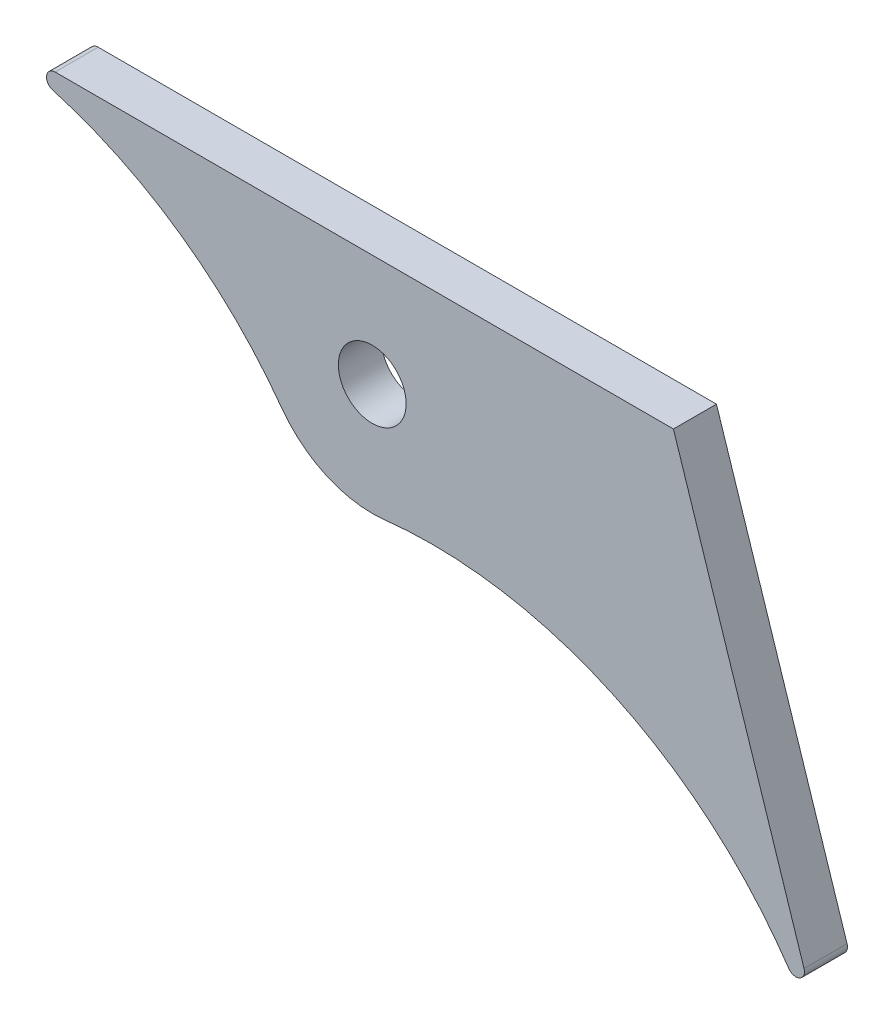
ISO-10303-21;
HEADER;
FILE_DESCRIPTION(('STEP AP214'),'2;1');
FILE_NAME('part.step','',(''),(''),'','','');
FILE_SCHEMA(('AUTOMOTIVE_DESIGN { 1 0 10303 214 1 1 1 1 }'));
ENDSEC;
DATA;
#1=APPLICATION_CONTEXT('core data for automotive mechanical design processes');
#2=APPLICATION_PROTOCOL_DEFINITION('international standard','automotive_design',2000,#1);
#3=PRODUCT_CONTEXT('',#1,'mechanical');
#4=PRODUCT('Part','Part','',(#3));
#5=PRODUCT_RELATED_PRODUCT_CATEGORY('part','',(#4));
#6=PRODUCT_DEFINITION_FORMATION('','',#4);
#7=PRODUCT_DEFINITION_CONTEXT('part definition',#1,'design');
#8=PRODUCT_DEFINITION('design','',#6,#7);
#9=PRODUCT_DEFINITION_SHAPE('','',#8);
#10=(LENGTH_UNIT() NAMED_UNIT(*) SI_UNIT(.MILLI.,.METRE.));
#11=(NAMED_UNIT(*) PLANE_ANGLE_UNIT() SI_UNIT($,.RADIAN.));
#12=(NAMED_UNIT(*) SI_UNIT($,.STERADIAN.) SOLID_ANGLE_UNIT());
#13=UNCERTAINTY_MEASURE_WITH_UNIT(LENGTH_MEASURE(1.E-05),#10,'distance_accuracy_value','');
#14=(GEOMETRIC_REPRESENTATION_CONTEXT(3) GLOBAL_UNCERTAINTY_ASSIGNED_CONTEXT((#13)) GLOBAL_UNIT_ASSIGNED_CONTEXT((#10,
#11,#12)) REPRESENTATION_CONTEXT('',''));
#15=CARTESIAN_POINT('',(0.,0.,0.));
#16=DIRECTION('',(0.,0.,1.));
#17=DIRECTION('',(1.,0.,0.));
#18=AXIS2_PLACEMENT_3D('',#15,#16,#17);
#19=CARTESIAN_POINT('',(-35.5673093415989,-96.0253941489769,6.35));
#20=DIRECTION('',(0.,0.,1.));
#21=DIRECTION('',(1.,0.,0.));
#22=AXIS2_PLACEMENT_3D('',#19,#20,#21);
#23=PLANE('',#22);
#24=DIRECTION('',(-1.,0.,0.));
#25=VECTOR('',#24,1.);
#26=CARTESIAN_POINT('',(0.,0.,6.35));
#27=LINE('',#26,#25);
#28=CARTESIAN_POINT('',(0.,0.,6.35));
#29=VERTEX_POINT('',#28);
#30=CARTESIAN_POINT('',(-91.24703558049,0.,6.35));
#31=VERTEX_POINT('',#30);
#32=EDGE_CURVE('E100',#29,#31,#27,.T.);
#33=ORIENTED_EDGE('',*,*,#32,.T.);
#34=CARTESIAN_POINT('',(-91.24703558049,-1.27000000000001,6.35));
#35=DIRECTION('',(0.,0.,1.));
#36=DIRECTION('',(1.,0.,0.));
#37=AXIS2_PLACEMENT_3D('',#34,#35,#36);
#38=CIRCLE('',#37,1.27);
#39=CARTESIAN_POINT('',(-91.5992024871987,-2.49019607843137,6.35));
#40=VERTEX_POINT('',#39);
#41=EDGE_CURVE('E146',#31,#40,#38,.T.);
#42=ORIENTED_EDGE('',*,*,#41,.T.);
#43=CARTESIAN_POINT('',(-109.207547822628,-63.5,6.35));
#44=DIRECTION('',(0.,0.,-1.));
#45=DIRECTION('',(1.,0.,0.));
#46=AXIS2_PLACEMENT_3D('',#43,#44,#45);
#47=CIRCLE('',#46,63.5);
#48=CARTESIAN_POINT('',(-57.8126685983201,-26.2063492063492,6.35));
#49=VERTEX_POINT('',#48);
#50=EDGE_CURVE('E117',#40,#49,#47,.T.);
#51=ORIENTED_EDGE('',*,*,#50,.T.);
#52=CARTESIAN_POINT('',(-44.45,-16.51,6.35));
#53=DIRECTION('',(0.,0.,1.));
#54=DIRECTION('',(1.,0.,0.));
#55=AXIS2_PLACEMENT_3D('',#52,#53,#54);
#56=CIRCLE('',#55,16.51);
#57=CARTESIAN_POINT('',(-42.6170638323934,-32.9179384751857,6.35));
#58=VERTEX_POINT('',#57);
#59=EDGE_CURVE('E180',#49,#58,#56,.T.);
#60=ORIENTED_EDGE('',*,*,#59,.T.);
#61=CARTESIAN_POINT('',(-35.5673093415989,-96.0253941489769,6.35));
#62=DIRECTION('',(0.,0.,-1.));
#63=DIRECTION('',(1.,0.,0.));
#64=AXIS2_PLACEMENT_3D('',#61,#62,#63);
#65=CIRCLE('',#64,63.5);
#66=CARTESIAN_POINT('',(17.0151842844278,-60.4257963412929,6.35));
#67=VERTEX_POINT('',#66);
#68=EDGE_CURVE('E167',#58,#67,#65,.T.);
#69=ORIENTED_EDGE('',*,*,#68,.T.);
#70=CARTESIAN_POINT('',(18.0668341569483,-59.7138043851392,6.35));
#71=DIRECTION('',(0.,0.,1.));
#72=DIRECTION('',(1.,0.,0.));
#73=AXIS2_PLACEMENT_3D('',#70,#71,#72);
#74=CIRCLE('',#73,1.27);
#75=CARTESIAN_POINT('',(19.2746759326432,-59.321352802283,6.35));
#76=VERTEX_POINT('',#75);
#77=EDGE_CURVE('E60',#67,#76,#74,.T.);
#78=ORIENTED_EDGE('',*,*,#77,.T.);
#79=DIRECTION('',(-0.309016994374952,0.951056516295152,0.));
#80=VECTOR('',#79,1.);
#81=CARTESIAN_POINT('',(0.,0.,6.35));
#82=LINE('',#81,#80);
#83=EDGE_CURVE('E97',#76,#29,#82,.T.);
#84=ORIENTED_EDGE('',*,*,#83,.T.);
#85=EDGE_LOOP('',(#33,#42,#51,#60,#69,#78,#84));
#86=FACE_BOUND('',#85,.T.);
#87=CARTESIAN_POINT('',(-44.45,-16.51,6.35));
#88=DIRECTION('',(0.,0.,1.));
#89=DIRECTION('',(1.,0.,0.));
#90=AXIS2_PLACEMENT_3D('',#87,#88,#89);
#91=CIRCLE('',#90,5.);
#92=CARTESIAN_POINT('',(-39.45,-16.51,6.35));
#93=VERTEX_POINT('',#92);
#94=EDGE_CURVE('E157',#93,#93,#91,.T.);
#95=ORIENTED_EDGE('',*,*,#94,.F.);
#96=EDGE_LOOP('',(#95));
#97=FACE_BOUND('',#96,.T.);
#98=ADVANCED_FACE('F39',(#86,#97),#23,.T.);
#99=CARTESIAN_POINT('',(-35.5673093415989,-96.0253941489769,0.));
#100=DIRECTION('',(0.,0.,1.));
#101=DIRECTION('',(1.,0.,0.));
#102=AXIS2_PLACEMENT_3D('',#99,#100,#101);
#103=PLANE('',#102);
#104=CARTESIAN_POINT('',(-109.207547822628,-63.5,0.));
#105=DIRECTION('',(0.,0.,-1.));
#106=DIRECTION('',(1.,0.,0.));
#107=AXIS2_PLACEMENT_3D('',#104,#105,#106);
#108=CIRCLE('',#107,63.5);
#109=CARTESIAN_POINT('',(-91.5992024871987,-2.49019607843137,0.));
#110=VERTEX_POINT('',#109);
#111=CARTESIAN_POINT('',(-57.8126685983201,-26.2063492063492,0.));
#112=VERTEX_POINT('',#111);
#113=EDGE_CURVE('E161',#110,#112,#108,.T.);
#114=ORIENTED_EDGE('',*,*,#113,.F.);
#115=CARTESIAN_POINT('',(-91.24703558049,-1.27000000000001,0.));
#116=DIRECTION('',(0.,0.,1.));
#117=DIRECTION('',(1.,0.,0.));
#118=AXIS2_PLACEMENT_3D('',#115,#116,#117);
#119=CIRCLE('',#118,1.27);
#120=CARTESIAN_POINT('',(-91.24703558049,0.,0.));
#121=VERTEX_POINT('',#120);
#122=EDGE_CURVE('E139',#110,#121,#119,.F.);
#123=ORIENTED_EDGE('',*,*,#122,.T.);
#124=DIRECTION('',(-1.,0.,0.));
#125=VECTOR('',#124,1.);
#126=CARTESIAN_POINT('',(-44.45,0.,0.));
#127=LINE('',#126,#125);
#128=CARTESIAN_POINT('',(0.,0.,0.));
#129=VERTEX_POINT('',#128);
#130=EDGE_CURVE('E155',#129,#121,#127,.T.);
#131=ORIENTED_EDGE('',*,*,#130,.F.);
#132=DIRECTION('',(-0.309016994374952,0.951056516295152,0.));
#133=VECTOR('',#132,1.);
#134=CARTESIAN_POINT('',(0.,0.,0.));
#135=LINE('',#134,#133);
#136=CARTESIAN_POINT('',(19.2746759326432,-59.321352802283,0.));
#137=VERTEX_POINT('',#136);
#138=EDGE_CURVE('E121',#137,#129,#135,.T.);
#139=ORIENTED_EDGE('',*,*,#138,.F.);
#140=CARTESIAN_POINT('',(18.0668341569483,-59.7138043851392,0.));
#141=DIRECTION('',(0.,0.,1.));
#142=DIRECTION('',(1.,0.,0.));
#143=AXIS2_PLACEMENT_3D('',#140,#141,#142);
#144=CIRCLE('',#143,1.27);
#145=CARTESIAN_POINT('',(17.0151842844278,-60.4257963412929,0.));
#146=VERTEX_POINT('',#145);
#147=EDGE_CURVE('E130',#137,#146,#144,.F.);
#148=ORIENTED_EDGE('',*,*,#147,.T.);
#149=CARTESIAN_POINT('',(-35.5673093415989,-96.0253941489769,0.));
#150=DIRECTION('',(0.,0.,-1.));
#151=DIRECTION('',(1.,0.,0.));
#152=AXIS2_PLACEMENT_3D('',#149,#150,#151);
#153=CIRCLE('',#152,63.5);
#154=CARTESIAN_POINT('',(-42.6170638323934,-32.9179384751857,0.));
#155=VERTEX_POINT('',#154);
#156=EDGE_CURVE('E107',#155,#146,#153,.T.);
#157=ORIENTED_EDGE('',*,*,#156,.F.);
#158=CARTESIAN_POINT('',(-44.45,-16.51,0.));
#159=DIRECTION('',(0.,0.,1.));
#160=DIRECTION('',(1.,0.,0.));
#161=AXIS2_PLACEMENT_3D('',#158,#159,#160);
#162=CIRCLE('',#161,16.51);
#163=EDGE_CURVE('E172',#112,#155,#162,.T.);
#164=ORIENTED_EDGE('',*,*,#163,.F.);
#165=EDGE_LOOP('',(#114,#123,#131,#139,#148,#157,#164));
#166=FACE_BOUND('',#165,.T.);
#167=CARTESIAN_POINT('',(-44.45,-16.51,0.));
#168=DIRECTION('',(0.,0.,1.));
#169=DIRECTION('',(1.,0.,0.));
#170=AXIS2_PLACEMENT_3D('',#167,#168,#169);
#171=CIRCLE('',#170,5.);
#172=CARTESIAN_POINT('',(-39.45,-16.51,0.));
#173=VERTEX_POINT('',#172);
#174=EDGE_CURVE('E164',#173,#173,#171,.T.);
#175=ORIENTED_EDGE('',*,*,#174,.T.);
#176=EDGE_LOOP('',(#175));
#177=FACE_BOUND('',#176,.T.);
#178=ADVANCED_FACE('F152',(#166,#177),#103,.F.);
#179=CARTESIAN_POINT('',(0.,0.,6.35));
#180=DIRECTION('',(-0.951056516295152,-0.309016994374952,0.));
#181=DIRECTION('',(0.309016994374952,-0.951056516295152,0.));
#182=AXIS2_PLACEMENT_3D('',#179,#180,#181);
#183=PLANE('',#182);
#184=ORIENTED_EDGE('',*,*,#83,.F.);
#185=DIRECTION('',(0.,0.,-1.));
#186=VECTOR('',#185,1.);
#187=CARTESIAN_POINT('',(19.2746759326432,-59.321352802283,6.35));
#188=LINE('',#187,#186);
#189=EDGE_CURVE('E48',#76,#137,#188,.T.);
#190=ORIENTED_EDGE('',*,*,#189,.T.);
#191=ORIENTED_EDGE('',*,*,#138,.T.);
#192=DIRECTION('',(0.,0.,-1.));
#193=VECTOR('',#192,1.);
#194=CARTESIAN_POINT('',(0.,0.,6.35));
#195=LINE('',#194,#193);
#196=EDGE_CURVE('E113',#29,#129,#195,.T.);
#197=ORIENTED_EDGE('',*,*,#196,.F.);
#198=EDGE_LOOP('',(#184,#190,#191,#197));
#199=FACE_BOUND('',#198,.T.);
#200=ADVANCED_FACE('F119',(#199),#183,.F.);
#201=CARTESIAN_POINT('',(-44.45,0.,6.35));
#202=DIRECTION('',(0.,-1.,0.));
#203=DIRECTION('',(1.,0.,0.));
#204=AXIS2_PLACEMENT_3D('',#201,#202,#203);
#205=PLANE('',#204);
#206=ORIENTED_EDGE('',*,*,#130,.T.);
#207=DIRECTION('',(0.,0.,-1.));
#208=VECTOR('',#207,1.);
#209=CARTESIAN_POINT('',(-91.24703558049,0.,6.35));
#210=LINE('',#209,#208);
#211=EDGE_CURVE('E115',#121,#31,#210,.F.);
#212=ORIENTED_EDGE('',*,*,#211,.T.);
#213=ORIENTED_EDGE('',*,*,#32,.F.);
#214=ORIENTED_EDGE('',*,*,#196,.T.);
#215=EDGE_LOOP('',(#206,#212,#213,#214));
#216=FACE_BOUND('',#215,.T.);
#217=ADVANCED_FACE('F112',(#216),#205,.F.);
#218=CARTESIAN_POINT('',(-109.207547822628,-63.5,6.35));
#219=DIRECTION('',(0.,0.,-1.));
#220=DIRECTION('',(-1.,0.,0.));
#221=AXIS2_PLACEMENT_3D('',#218,#219,#220);
#222=CYLINDRICAL_SURFACE('',#221,63.5);
#223=ORIENTED_EDGE('',*,*,#50,.F.);
#224=DIRECTION('',(0.,0.,-1.));
#225=VECTOR('',#224,1.);
#226=CARTESIAN_POINT('',(-91.5992024871987,-2.49019607843137,6.35));
#227=LINE('',#226,#225);
#228=EDGE_CURVE('E124',#40,#110,#227,.T.);
#229=ORIENTED_EDGE('',*,*,#228,.T.);
#230=ORIENTED_EDGE('',*,*,#113,.T.);
#231=DIRECTION('',(0.,0.,-1.));
#232=VECTOR('',#231,1.);
#233=CARTESIAN_POINT('',(-57.8126685983201,-26.2063492063492,6.35));
#234=LINE('',#233,#232);
#235=EDGE_CURVE('E125',#49,#112,#234,.T.);
#236=ORIENTED_EDGE('',*,*,#235,.F.);
#237=EDGE_LOOP('',(#223,#229,#230,#236));
#238=FACE_BOUND('',#237,.T.);
#239=ADVANCED_FACE('F212',(#238),#222,.F.);
#240=CARTESIAN_POINT('',(-44.45,-16.51,6.35));
#241=DIRECTION('',(0.,0.,-1.));
#242=DIRECTION('',(-1.,0.,0.));
#243=AXIS2_PLACEMENT_3D('',#240,#241,#242);
#244=CYLINDRICAL_SURFACE('',#243,16.51);
#245=ORIENTED_EDGE('',*,*,#163,.T.);
#246=DIRECTION('',(0.,0.,-1.));
#247=VECTOR('',#246,1.);
#248=CARTESIAN_POINT('',(-42.6170638323934,-32.9179384751857,6.35));
#249=LINE('',#248,#247);
#250=EDGE_CURVE('E133',#58,#155,#249,.T.);
#251=ORIENTED_EDGE('',*,*,#250,.F.);
#252=ORIENTED_EDGE('',*,*,#59,.F.);
#253=ORIENTED_EDGE('',*,*,#235,.T.);
#254=EDGE_LOOP('',(#245,#251,#252,#253));
#255=FACE_BOUND('',#254,.T.);
#256=ADVANCED_FACE('F201',(#255),#244,.T.);
#257=CARTESIAN_POINT('',(-35.5673093415989,-96.0253941489769,6.35));
#258=DIRECTION('',(0.,0.,-1.));
#259=DIRECTION('',(-1.,0.,0.));
#260=AXIS2_PLACEMENT_3D('',#257,#258,#259);
#261=CYLINDRICAL_SURFACE('',#260,63.5);
#262=ORIENTED_EDGE('',*,*,#156,.T.);
#263=DIRECTION('',(0.,0.,-1.));
#264=VECTOR('',#263,1.);
#265=CARTESIAN_POINT('',(17.0151842844278,-60.4257963412929,6.35));
#266=LINE('',#265,#264);
#267=EDGE_CURVE('E11',#146,#67,#266,.F.);
#268=ORIENTED_EDGE('',*,*,#267,.T.);
#269=ORIENTED_EDGE('',*,*,#68,.F.);
#270=ORIENTED_EDGE('',*,*,#250,.T.);
#271=EDGE_LOOP('',(#262,#268,#269,#270));
#272=FACE_BOUND('',#271,.T.);
#273=ADVANCED_FACE('F193',(#272),#261,.F.);
#274=CARTESIAN_POINT('',(-44.45,-16.51,6.35));
#275=DIRECTION('',(0.,0.,-1.));
#276=DIRECTION('',(-1.,0.,0.));
#277=AXIS2_PLACEMENT_3D('',#274,#275,#276);
#278=CYLINDRICAL_SURFACE('',#277,5.);
#279=ORIENTED_EDGE('',*,*,#94,.T.);
#280=EDGE_LOOP('',(#279));
#281=FACE_BOUND('',#280,.T.);
#282=ORIENTED_EDGE('',*,*,#174,.F.);
#283=EDGE_LOOP('',(#282));
#284=FACE_BOUND('',#283,.T.);
#285=ADVANCED_FACE('F190',(#281,#284),#278,.F.);
#286=CARTESIAN_POINT('',(-91.24703558049,-1.27000000000001,6.35));
#287=DIRECTION('',(0.,0.,-1.));
#288=DIRECTION('',(-1.,0.,0.));
#289=AXIS2_PLACEMENT_3D('',#286,#287,#288);
#290=CYLINDRICAL_SURFACE('',#289,1.27);
#291=ORIENTED_EDGE('',*,*,#41,.F.);
#292=ORIENTED_EDGE('',*,*,#211,.F.);
#293=ORIENTED_EDGE('',*,*,#122,.F.);
#294=ORIENTED_EDGE('',*,*,#228,.F.);
#295=EDGE_LOOP('',(#291,#292,#293,#294));
#296=FACE_BOUND('',#295,.T.);
#297=ADVANCED_FACE('F192',(#296),#290,.T.);
#298=CARTESIAN_POINT('',(18.0668341569483,-59.7138043851392,6.35));
#299=DIRECTION('',(0.,0.,-1.));
#300=DIRECTION('',(-1.,0.,0.));
#301=AXIS2_PLACEMENT_3D('',#298,#299,#300);
#302=CYLINDRICAL_SURFACE('',#301,1.27);
#303=ORIENTED_EDGE('',*,*,#77,.F.);
#304=ORIENTED_EDGE('',*,*,#267,.F.);
#305=ORIENTED_EDGE('',*,*,#147,.F.);
#306=ORIENTED_EDGE('',*,*,#189,.F.);
#307=EDGE_LOOP('',(#303,#304,#305,#306));
#308=FACE_BOUND('',#307,.T.);
#309=ADVANCED_FACE('F41',(#308),#302,.T.);
#310=CLOSED_SHELL('',(#98,#178,#200,#217,#239,#256,#273,#285,#297,#309));
#311=MANIFOLD_SOLID_BREP('B2',#310);
#312=ADVANCED_BREP_SHAPE_REPRESENTATION('',(#18,#311),#14);
#313=SHAPE_DEFINITION_REPRESENTATION(#9,#312);
ENDSEC;
END-ISO-10303-21;
